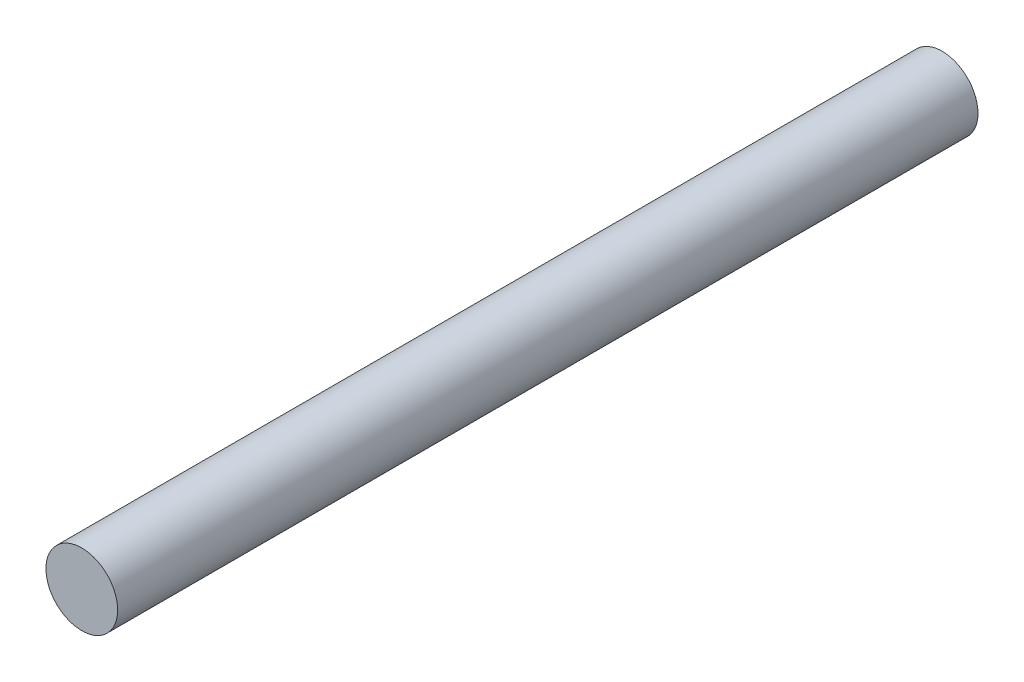
ISO-10303-21;
HEADER;
FILE_DESCRIPTION(('STEP AP214'),'2;1');
FILE_NAME('part.step','',(''),(''),'','','');
FILE_SCHEMA(('AUTOMOTIVE_DESIGN { 1 0 10303 214 1 1 1 1 }'));
ENDSEC;
DATA;
#1=APPLICATION_CONTEXT('core data for automotive mechanical design processes');
#2=APPLICATION_PROTOCOL_DEFINITION('international standard','automotive_design',2000,#1);
#3=PRODUCT_CONTEXT('',#1,'mechanical');
#4=PRODUCT('Part','Part','',(#3));
#5=PRODUCT_RELATED_PRODUCT_CATEGORY('part','',(#4));
#6=PRODUCT_DEFINITION_FORMATION('','',#4);
#7=PRODUCT_DEFINITION_CONTEXT('part definition',#1,'design');
#8=PRODUCT_DEFINITION('design','',#6,#7);
#9=PRODUCT_DEFINITION_SHAPE('','',#8);
#10=(LENGTH_UNIT() NAMED_UNIT(*) SI_UNIT(.MILLI.,.METRE.));
#11=(NAMED_UNIT(*) PLANE_ANGLE_UNIT() SI_UNIT($,.RADIAN.));
#12=(NAMED_UNIT(*) SI_UNIT($,.STERADIAN.) SOLID_ANGLE_UNIT());
#13=UNCERTAINTY_MEASURE_WITH_UNIT(LENGTH_MEASURE(1.E-05),#10,'distance_accuracy_value','');
#14=(GEOMETRIC_REPRESENTATION_CONTEXT(3) GLOBAL_UNCERTAINTY_ASSIGNED_CONTEXT((#13)) GLOBAL_UNIT_ASSIGNED_CONTEXT((#10,
#11,#12)) REPRESENTATION_CONTEXT('',''));
#15=CARTESIAN_POINT('',(0.,0.,0.));
#16=DIRECTION('',(0.,0.,1.));
#17=DIRECTION('',(1.,0.,0.));
#18=AXIS2_PLACEMENT_3D('',#15,#16,#17);
#19=CARTESIAN_POINT('',(0.,0.,6000.));
#20=DIRECTION('',(0.,0.,-1.));
#21=DIRECTION('',(-1.,0.,0.));
#22=AXIS2_PLACEMENT_3D('',#19,#20,#21);
#23=CYLINDRICAL_SURFACE('',#22,250.);
#24=CARTESIAN_POINT('',(0.,0.,6000.));
#25=DIRECTION('',(0.,0.,1.));
#26=DIRECTION('',(1.,0.,0.));
#27=AXIS2_PLACEMENT_3D('',#24,#25,#26);
#28=CIRCLE('',#27,250.);
#29=CARTESIAN_POINT('',(250.,0.,6000.));
#30=VERTEX_POINT('',#29);
#31=EDGE_CURVE('E10',#30,#30,#28,.T.);
#32=ORIENTED_EDGE('',*,*,#31,.F.);
#33=EDGE_LOOP('',(#32));
#34=FACE_BOUND('',#33,.T.);
#35=CARTESIAN_POINT('',(0.,0.,0.));
#36=DIRECTION('',(0.,0.,1.));
#37=DIRECTION('',(1.,0.,0.));
#38=AXIS2_PLACEMENT_3D('',#35,#36,#37);
#39=CIRCLE('',#38,250.);
#40=CARTESIAN_POINT('',(250.,0.,0.));
#41=VERTEX_POINT('',#40);
#42=EDGE_CURVE('E38',#41,#41,#39,.T.);
#43=ORIENTED_EDGE('',*,*,#42,.T.);
#44=EDGE_LOOP('',(#43));
#45=FACE_BOUND('',#44,.T.);
#46=ADVANCED_FACE('F35',(#34,#45),#23,.T.);
#47=CARTESIAN_POINT('',(0.,0.,6000.));
#48=DIRECTION('',(0.,0.,1.));
#49=DIRECTION('',(1.,0.,0.));
#50=AXIS2_PLACEMENT_3D('',#47,#48,#49);
#51=PLANE('',#50);
#52=ORIENTED_EDGE('',*,*,#31,.T.);
#53=EDGE_LOOP('',(#52));
#54=FACE_BOUND('',#53,.T.);
#55=ADVANCED_FACE('F50',(#54),#51,.T.);
#56=CARTESIAN_POINT('',(0.,0.,0.));
#57=DIRECTION('',(0.,0.,1.));
#58=DIRECTION('',(1.,0.,0.));
#59=AXIS2_PLACEMENT_3D('',#56,#57,#58);
#60=PLANE('',#59);
#61=ORIENTED_EDGE('',*,*,#42,.F.);
#62=EDGE_LOOP('',(#61));
#63=FACE_BOUND('',#62,.T.);
#64=ADVANCED_FACE('F48',(#63),#60,.F.);
#65=CLOSED_SHELL('',(#46,#55,#64));
#66=MANIFOLD_SOLID_BREP('B2',#65);
#67=ADVANCED_BREP_SHAPE_REPRESENTATION('',(#18,#66),#14);
#68=SHAPE_DEFINITION_REPRESENTATION(#9,#67);
ENDSEC;
END-ISO-10303-21;
